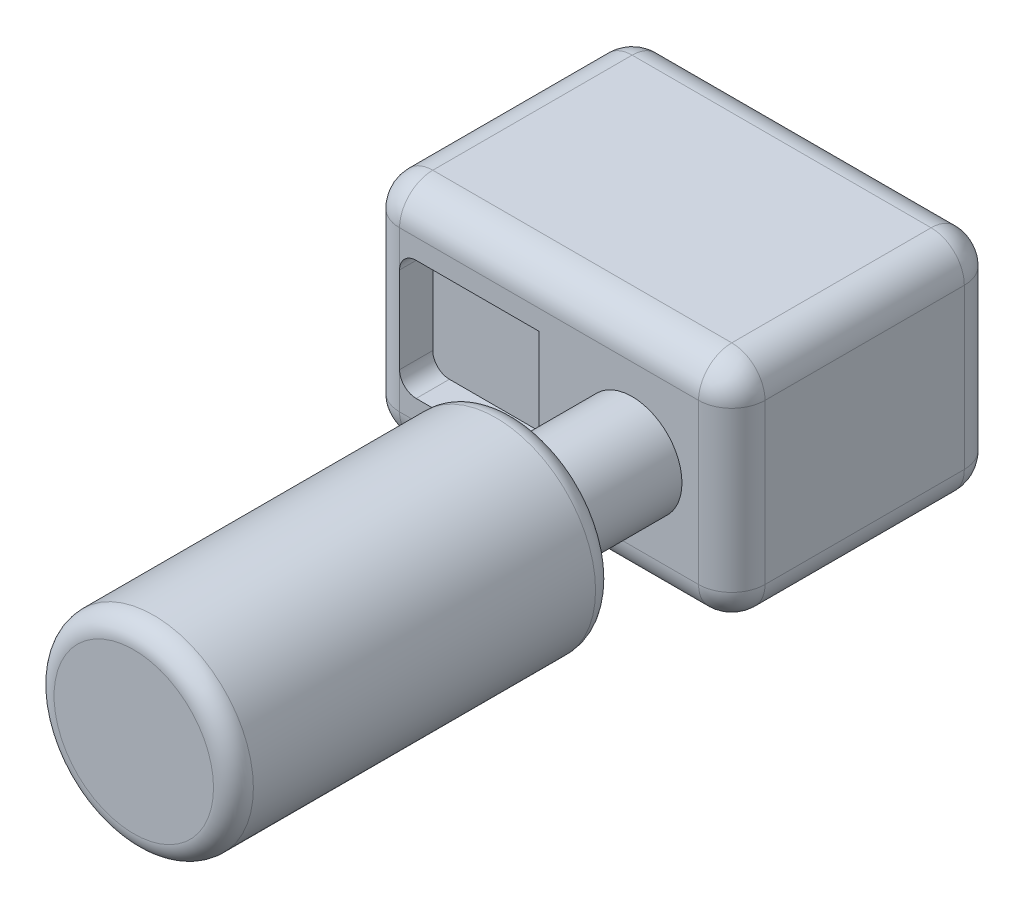
ISO-10303-21;
HEADER;
FILE_DESCRIPTION(('STEP AP214'),'2;1');
FILE_NAME('part.step','',(''),(''),'','','');
FILE_SCHEMA(('AUTOMOTIVE_DESIGN { 1 0 10303 214 1 1 1 1 }'));
ENDSEC;
DATA;
#1=APPLICATION_CONTEXT('core data for automotive mechanical design processes');
#2=APPLICATION_PROTOCOL_DEFINITION('international standard','automotive_design',2000,#1);
#3=PRODUCT_CONTEXT('',#1,'mechanical');
#4=PRODUCT('Part','Part','',(#3));
#5=PRODUCT_RELATED_PRODUCT_CATEGORY('part','',(#4));
#6=PRODUCT_DEFINITION_FORMATION('','',#4);
#7=PRODUCT_DEFINITION_CONTEXT('part definition',#1,'design');
#8=PRODUCT_DEFINITION('design','',#6,#7);
#9=PRODUCT_DEFINITION_SHAPE('','',#8);
#10=(LENGTH_UNIT() NAMED_UNIT(*) SI_UNIT(.MILLI.,.METRE.));
#11=(NAMED_UNIT(*) PLANE_ANGLE_UNIT() SI_UNIT($,.RADIAN.));
#12=(NAMED_UNIT(*) SI_UNIT($,.STERADIAN.) SOLID_ANGLE_UNIT());
#13=UNCERTAINTY_MEASURE_WITH_UNIT(LENGTH_MEASURE(1.E-05),#10,'distance_accuracy_value','');
#14=(GEOMETRIC_REPRESENTATION_CONTEXT(3) GLOBAL_UNCERTAINTY_ASSIGNED_CONTEXT((#13)) GLOBAL_UNIT_ASSIGNED_CONTEXT((#10,
#11,#12)) REPRESENTATION_CONTEXT('',''));
#15=CARTESIAN_POINT('',(0.,0.,0.));
#16=DIRECTION('',(0.,0.,1.));
#17=DIRECTION('',(1.,0.,0.));
#18=AXIS2_PLACEMENT_3D('',#15,#16,#17);
#19=CARTESIAN_POINT('',(46.5074696188145,14.2749169435216,230.));
#20=DIRECTION('',(0.,0.,-1.));
#21=DIRECTION('',(-1.,0.,0.));
#22=AXIS2_PLACEMENT_3D('',#19,#20,#21);
#23=CYLINDRICAL_SURFACE('',#22,30.);
#24=CARTESIAN_POINT('',(46.5074696188145,14.2749169435216,121.));
#25=DIRECTION('',(0.,0.,1.));
#26=DIRECTION('',(1.,0.,0.));
#27=AXIS2_PLACEMENT_3D('',#24,#25,#26);
#28=CIRCLE('',#27,30.);
#29=CARTESIAN_POINT('',(76.5074696188145,14.2749169435216,121.));
#30=VERTEX_POINT('',#29);
#31=EDGE_CURVE('E237',#30,#30,#28,.T.);
#32=ORIENTED_EDGE('',*,*,#31,.T.);
#33=EDGE_LOOP('',(#32));
#34=FACE_BOUND('',#33,.T.);
#35=CARTESIAN_POINT('',(46.5074696188145,14.2749169435216,224.));
#36=DIRECTION('',(0.,0.,1.));
#37=DIRECTION('',(1.,0.,0.));
#38=AXIS2_PLACEMENT_3D('',#35,#36,#37);
#39=CIRCLE('',#38,30.);
#40=CARTESIAN_POINT('',(76.5074696188145,14.2749169435216,224.));
#41=VERTEX_POINT('',#40);
#42=EDGE_CURVE('E234',#41,#41,#39,.F.);
#43=ORIENTED_EDGE('',*,*,#42,.T.);
#44=EDGE_LOOP('',(#43));
#45=FACE_BOUND('',#44,.T.);
#46=ADVANCED_FACE('F41',(#34,#45),#23,.T.);
#47=CARTESIAN_POINT('',(46.5074696188145,14.2749169435216,230.));
#48=DIRECTION('',(0.,0.,1.));
#49=DIRECTION('',(1.,0.,0.));
#50=AXIS2_PLACEMENT_3D('',#47,#48,#49);
#51=PLANE('',#50);
#52=CARTESIAN_POINT('',(46.5074696188145,14.2749169435216,230.));
#53=DIRECTION('',(0.,0.,1.));
#54=DIRECTION('',(1.,0.,0.));
#55=AXIS2_PLACEMENT_3D('',#52,#53,#54);
#56=CIRCLE('',#55,24.);
#57=CARTESIAN_POINT('',(70.5074696188145,14.2749169435216,230.));
#58=VERTEX_POINT('',#57);
#59=EDGE_CURVE('E227',#58,#58,#56,.T.);
#60=ORIENTED_EDGE('',*,*,#59,.T.);
#61=EDGE_LOOP('',(#60));
#62=FACE_BOUND('',#61,.T.);
#63=ADVANCED_FACE('F426',(#62),#51,.T.);
#64=CARTESIAN_POINT('',(46.5074696188145,14.2749169435216,224.));
#65=DIRECTION('',(0.,0.,1.));
#66=DIRECTION('',(1.,0.,0.));
#67=AXIS2_PLACEMENT_3D('',#64,#65,#66);
#68=TOROIDAL_SURFACE('',#67,24.,6.);
#69=ORIENTED_EDGE('',*,*,#42,.F.);
#70=EDGE_LOOP('',(#69));
#71=FACE_BOUND('',#70,.T.);
#72=ORIENTED_EDGE('',*,*,#59,.F.);
#73=EDGE_LOOP('',(#72));
#74=FACE_BOUND('',#73,.T.);
#75=ADVANCED_FACE('F432',(#71,#74),#68,.T.);
#76=CARTESIAN_POINT('',(46.5074696188145,14.2749169435216,115.));
#77=DIRECTION('',(0.,0.,1.));
#78=DIRECTION('',(1.,0.,0.));
#79=AXIS2_PLACEMENT_3D('',#76,#77,#78);
#80=PLANE('',#79);
#81=CARTESIAN_POINT('',(46.5074696188145,14.2749169435216,115.));
#82=DIRECTION('',(0.,0.,1.));
#83=DIRECTION('',(1.,0.,0.));
#84=AXIS2_PLACEMENT_3D('',#81,#82,#83);
#85=CIRCLE('',#84,24.);
#86=CARTESIAN_POINT('',(70.5074696188145,14.2749169435216,115.));
#87=VERTEX_POINT('',#86);
#88=EDGE_CURVE('E240',#87,#87,#85,.F.);
#89=ORIENTED_EDGE('',*,*,#88,.T.);
#90=EDGE_LOOP('',(#89));
#91=FACE_BOUND('',#90,.T.);
#92=CARTESIAN_POINT('',(46.5074696188145,14.2749169435216,115.));
#93=DIRECTION('',(0.,0.,1.));
#94=DIRECTION('',(1.,0.,0.));
#95=AXIS2_PLACEMENT_3D('',#92,#93,#94);
#96=CIRCLE('',#95,15.);
#97=CARTESIAN_POINT('',(61.5074696188145,14.2749169435216,115.));
#98=VERTEX_POINT('',#97);
#99=EDGE_CURVE('E224',#98,#98,#96,.T.);
#100=ORIENTED_EDGE('',*,*,#99,.T.);
#101=EDGE_LOOP('',(#100));
#102=FACE_BOUND('',#101,.T.);
#103=ADVANCED_FACE('F461',(#91,#102),#80,.F.);
#104=CARTESIAN_POINT('',(46.5074696188145,14.2749169435216,115.));
#105=DIRECTION('',(0.,0.,-1.));
#106=DIRECTION('',(-1.,0.,0.));
#107=AXIS2_PLACEMENT_3D('',#104,#105,#106);
#108=CYLINDRICAL_SURFACE('',#107,15.);
#109=ORIENTED_EDGE('',*,*,#99,.F.);
#110=EDGE_LOOP('',(#109));
#111=FACE_BOUND('',#110,.T.);
#112=CARTESIAN_POINT('',(46.5074696188145,14.2749169435216,80.));
#113=DIRECTION('',(0.,0.,1.));
#114=DIRECTION('',(1.,0.,0.));
#115=AXIS2_PLACEMENT_3D('',#112,#113,#114);
#116=CIRCLE('',#115,15.);
#117=CARTESIAN_POINT('',(61.5074696188145,14.2749169435216,80.));
#118=VERTEX_POINT('',#117);
#119=EDGE_CURVE('E228',#118,#118,#116,.T.);
#120=ORIENTED_EDGE('',*,*,#119,.T.);
#121=EDGE_LOOP('',(#120));
#122=FACE_BOUND('',#121,.T.);
#123=ADVANCED_FACE('F447',(#111,#122),#108,.T.);
#124=CARTESIAN_POINT('',(0.,0.,0.));
#125=DIRECTION('',(0.,0.,1.));
#126=DIRECTION('',(1.,0.,0.));
#127=AXIS2_PLACEMENT_3D('',#124,#125,#126);
#128=PLANE('',#127);
#129=DIRECTION('',(-1.,0.,0.));
#130=VECTOR('',#129,1.);
#131=CARTESIAN_POINT('',(0.,38.2749169435216,0.));
#132=LINE('',#131,#130);
#133=CARTESIAN_POINT('',(-23.4925303811855,38.2749169435216,0.));
#134=VERTEX_POINT('',#133);
#135=CARTESIAN_POINT('',(66.5074696188145,38.2749169435216,0.));
#136=VERTEX_POINT('',#135);
#137=EDGE_CURVE('E255',#134,#136,#132,.F.);
#138=ORIENTED_EDGE('',*,*,#137,.T.);
#139=DIRECTION('',(0.,1.,0.));
#140=VECTOR('',#139,1.);
#141=CARTESIAN_POINT('',(66.5074696188145,0.,0.));
#142=LINE('',#141,#140);
#143=CARTESIAN_POINT('',(66.5074696188145,-9.72508305647841,0.));
#144=VERTEX_POINT('',#143);
#145=EDGE_CURVE('E257',#136,#144,#142,.F.);
#146=ORIENTED_EDGE('',*,*,#145,.T.);
#147=DIRECTION('',(1.,0.,0.));
#148=VECTOR('',#147,1.);
#149=CARTESIAN_POINT('',(0.,-9.72508305647841,0.));
#150=LINE('',#149,#148);
#151=CARTESIAN_POINT('',(-23.4925303811855,-9.72508305647841,0.));
#152=VERTEX_POINT('',#151);
#153=EDGE_CURVE('E251',#144,#152,#150,.F.);
#154=ORIENTED_EDGE('',*,*,#153,.T.);
#155=DIRECTION('',(0.,-1.,0.));
#156=VECTOR('',#155,1.);
#157=CARTESIAN_POINT('',(-23.4925303811855,0.,0.));
#158=LINE('',#157,#156);
#159=EDGE_CURVE('E253',#152,#134,#158,.F.);
#160=ORIENTED_EDGE('',*,*,#159,.T.);
#161=EDGE_LOOP('',(#138,#146,#154,#160));
#162=FACE_BOUND('',#161,.T.);
#163=ADVANCED_FACE('F443',(#162),#128,.F.);
#164=CARTESIAN_POINT('',(-33.4925303811855,-19.7250830564784,80.));
#165=DIRECTION('',(0.,1.,0.));
#166=DIRECTION('',(0.,0.,1.));
#167=AXIS2_PLACEMENT_3D('',#164,#165,#166);
#168=PLANE('',#167);
#169=DIRECTION('',(1.,0.,0.));
#170=VECTOR('',#169,1.);
#171=CARTESIAN_POINT('',(-33.4925303811855,-19.7250830564784,70.));
#172=LINE('',#171,#170);
#173=CARTESIAN_POINT('',(66.5074696188145,-19.7250830564784,70.));
#174=VERTEX_POINT('',#173);
#175=CARTESIAN_POINT('',(-23.4925303811855,-19.7250830564784,70.));
#176=VERTEX_POINT('',#175);
#177=EDGE_CURVE('E287',#174,#176,#172,.F.);
#178=ORIENTED_EDGE('',*,*,#177,.T.);
#179=DIRECTION('',(0.,0.,-1.));
#180=VECTOR('',#179,1.);
#181=CARTESIAN_POINT('',(-23.4925303811855,-19.7250830564784,80.));
#182=LINE('',#181,#180);
#183=CARTESIAN_POINT('',(-23.4925303811855,-19.7250830564784,9.99999999999999));
#184=VERTEX_POINT('',#183);
#185=EDGE_CURVE('E294',#176,#184,#182,.T.);
#186=ORIENTED_EDGE('',*,*,#185,.T.);
#187=DIRECTION('',(1.,0.,0.));
#188=VECTOR('',#187,1.);
#189=CARTESIAN_POINT('',(-33.4925303811855,-19.7250830564784,9.99999999999999));
#190=LINE('',#189,#188);
#191=CARTESIAN_POINT('',(66.5074696188145,-19.7250830564784,9.99999999999999));
#192=VERTEX_POINT('',#191);
#193=EDGE_CURVE('E292',#184,#192,#190,.T.);
#194=ORIENTED_EDGE('',*,*,#193,.T.);
#195=DIRECTION('',(0.,0.,-1.));
#196=VECTOR('',#195,1.);
#197=CARTESIAN_POINT('',(66.5074696188145,-19.7250830564784,80.));
#198=LINE('',#197,#196);
#199=EDGE_CURVE('E289',#192,#174,#198,.F.);
#200=ORIENTED_EDGE('',*,*,#199,.T.);
#201=EDGE_LOOP('',(#178,#186,#194,#200));
#202=FACE_BOUND('',#201,.T.);
#203=ADVANCED_FACE('F446',(#202),#168,.F.);
#204=CARTESIAN_POINT('',(-33.4925303811855,48.2749169435216,80.));
#205=DIRECTION('',(1.,0.,0.));
#206=DIRECTION('',(0.,0.,-1.));
#207=AXIS2_PLACEMENT_3D('',#204,#205,#206);
#208=PLANE('',#207);
#209=DIRECTION('',(0.,-1.,0.));
#210=VECTOR('',#209,1.);
#211=CARTESIAN_POINT('',(-33.4925303811855,48.2749169435216,70.));
#212=LINE('',#211,#210);
#213=CARTESIAN_POINT('',(-33.4925303811855,-9.72508305647841,70.));
#214=VERTEX_POINT('',#213);
#215=CARTESIAN_POINT('',(-33.4925303811855,38.2749169435216,70.));
#216=VERTEX_POINT('',#215);
#217=EDGE_CURVE('E280',#214,#216,#212,.F.);
#218=ORIENTED_EDGE('',*,*,#217,.T.);
#219=DIRECTION('',(0.,0.,-1.));
#220=VECTOR('',#219,1.);
#221=CARTESIAN_POINT('',(-33.4925303811855,38.2749169435216,80.));
#222=LINE('',#221,#220);
#223=CARTESIAN_POINT('',(-33.4925303811855,38.2749169435216,9.99999999999999));
#224=VERTEX_POINT('',#223);
#225=EDGE_CURVE('E285',#216,#224,#222,.T.);
#226=ORIENTED_EDGE('',*,*,#225,.T.);
#227=DIRECTION('',(0.,-1.,0.));
#228=VECTOR('',#227,1.);
#229=CARTESIAN_POINT('',(-33.4925303811855,48.2749169435216,9.99999999999999));
#230=LINE('',#229,#228);
#231=CARTESIAN_POINT('',(-33.4925303811855,-9.72508305647841,9.99999999999999));
#232=VERTEX_POINT('',#231);
#233=EDGE_CURVE('E282',#224,#232,#230,.T.);
#234=ORIENTED_EDGE('',*,*,#233,.T.);
#235=DIRECTION('',(0.,0.,-1.));
#236=VECTOR('',#235,1.);
#237=CARTESIAN_POINT('',(-33.4925303811855,-9.72508305647841,80.));
#238=LINE('',#237,#236);
#239=EDGE_CURVE('E278',#232,#214,#238,.F.);
#240=ORIENTED_EDGE('',*,*,#239,.T.);
#241=EDGE_LOOP('',(#218,#226,#234,#240));
#242=FACE_BOUND('',#241,.T.);
#243=ADVANCED_FACE('F403',(#242),#208,.F.);
#244=CARTESIAN_POINT('',(-33.4925303811855,48.2749169435216,80.));
#245=DIRECTION('',(0.,-1.,0.));
#246=DIRECTION('',(0.,0.,-1.));
#247=AXIS2_PLACEMENT_3D('',#244,#245,#246);
#248=PLANE('',#247);
#249=DIRECTION('',(-1.,0.,0.));
#250=VECTOR('',#249,1.);
#251=CARTESIAN_POINT('',(76.5074696188145,48.2749169435216,70.));
#252=LINE('',#251,#250);
#253=CARTESIAN_POINT('',(-23.4925303811855,48.2749169435216,70.));
#254=VERTEX_POINT('',#253);
#255=CARTESIAN_POINT('',(66.5074696188145,48.2749169435216,70.));
#256=VERTEX_POINT('',#255);
#257=EDGE_CURVE('E262',#254,#256,#252,.F.);
#258=ORIENTED_EDGE('',*,*,#257,.T.);
#259=DIRECTION('',(0.,0.,-1.));
#260=VECTOR('',#259,1.);
#261=CARTESIAN_POINT('',(66.5074696188145,48.2749169435216,80.));
#262=LINE('',#261,#260);
#263=CARTESIAN_POINT('',(66.5074696188145,48.2749169435216,9.99999999999999));
#264=VERTEX_POINT('',#263);
#265=EDGE_CURVE('E267',#256,#264,#262,.T.);
#266=ORIENTED_EDGE('',*,*,#265,.T.);
#267=DIRECTION('',(-1.,0.,0.));
#268=VECTOR('',#267,1.);
#269=CARTESIAN_POINT('',(-33.4925303811855,48.2749169435216,9.99999999999999));
#270=LINE('',#269,#268);
#271=CARTESIAN_POINT('',(-23.4925303811855,48.2749169435216,9.99999999999999));
#272=VERTEX_POINT('',#271);
#273=EDGE_CURVE('E265',#264,#272,#270,.T.);
#274=ORIENTED_EDGE('',*,*,#273,.T.);
#275=DIRECTION('',(0.,0.,-1.));
#276=VECTOR('',#275,1.);
#277=CARTESIAN_POINT('',(-23.4925303811855,48.2749169435216,80.));
#278=LINE('',#277,#276);
#279=EDGE_CURVE('E260',#272,#254,#278,.F.);
#280=ORIENTED_EDGE('',*,*,#279,.T.);
#281=EDGE_LOOP('',(#258,#266,#274,#280));
#282=FACE_BOUND('',#281,.T.);
#283=ADVANCED_FACE('F372',(#282),#248,.F.);
#284=CARTESIAN_POINT('',(76.5074696188145,48.2749169435216,80.));
#285=DIRECTION('',(-1.,0.,0.));
#286=DIRECTION('',(0.,0.,1.));
#287=AXIS2_PLACEMENT_3D('',#284,#285,#286);
#288=PLANE('',#287);
#289=DIRECTION('',(0.,0.,-1.));
#290=VECTOR('',#289,1.);
#291=CARTESIAN_POINT('',(76.5074696188145,38.2749169435216,80.));
#292=LINE('',#291,#290);
#293=CARTESIAN_POINT('',(76.5074696188145,38.2749169435216,9.99999999999999));
#294=VERTEX_POINT('',#293);
#295=CARTESIAN_POINT('',(76.5074696188145,38.2749169435216,70.));
#296=VERTEX_POINT('',#295);
#297=EDGE_CURVE('E248',#294,#296,#292,.F.);
#298=ORIENTED_EDGE('',*,*,#297,.T.);
#299=DIRECTION('',(0.,1.,0.));
#300=VECTOR('',#299,1.);
#301=CARTESIAN_POINT('',(76.5074696188145,-9.72508305647841,70.));
#302=LINE('',#301,#300);
#303=CARTESIAN_POINT('',(76.5074696188145,-9.72508305647841,70.));
#304=VERTEX_POINT('',#303);
#305=EDGE_CURVE('E11',#296,#304,#302,.F.);
#306=ORIENTED_EDGE('',*,*,#305,.T.);
#307=DIRECTION('',(0.,0.,-1.));
#308=VECTOR('',#307,1.);
#309=CARTESIAN_POINT('',(76.5074696188145,-9.72508305647841,80.));
#310=LINE('',#309,#308);
#311=CARTESIAN_POINT('',(76.5074696188145,-9.72508305647841,9.99999999999999));
#312=VERTEX_POINT('',#311);
#313=EDGE_CURVE('E243',#304,#312,#310,.T.);
#314=ORIENTED_EDGE('',*,*,#313,.T.);
#315=DIRECTION('',(0.,1.,0.));
#316=VECTOR('',#315,1.);
#317=CARTESIAN_POINT('',(76.5074696188145,48.2749169435216,9.99999999999999));
#318=LINE('',#317,#316);
#319=EDGE_CURVE('E245',#312,#294,#318,.T.);
#320=ORIENTED_EDGE('',*,*,#319,.T.);
#321=EDGE_LOOP('',(#298,#306,#314,#320));
#322=FACE_BOUND('',#321,.T.);
#323=ADVANCED_FACE('F442',(#322),#288,.F.);
#324=CARTESIAN_POINT('',(0.,0.,80.));
#325=DIRECTION('',(0.,0.,1.));
#326=DIRECTION('',(1.,0.,0.));
#327=AXIS2_PLACEMENT_3D('',#324,#325,#326);
#328=PLANE('',#327);
#329=CARTESIAN_POINT('',(-18.4925303811855,1.2749169435216,80.));
#330=DIRECTION('',(0.,0.,1.));
#331=DIRECTION('',(1.,0.,0.));
#332=AXIS2_PLACEMENT_3D('',#329,#330,#331);
#333=CIRCLE('',#332,5.);
#334=CARTESIAN_POINT('',(-23.4925303811855,1.27491694352163,80.));
#335=VERTEX_POINT('',#334);
#336=CARTESIAN_POINT('',(-18.4925303811855,-3.7250830564784,80.));
#337=VERTEX_POINT('',#336);
#338=EDGE_CURVE('E195',#335,#337,#333,.T.);
#339=ORIENTED_EDGE('',*,*,#338,.F.);
#340=DIRECTION('',(0.,-1.,0.));
#341=VECTOR('',#340,1.);
#342=CARTESIAN_POINT('',(-23.4925303811855,-19.7250830564784,80.));
#343=LINE('',#342,#341);
#344=CARTESIAN_POINT('',(-23.4925303811855,-9.72508305647841,80.));
#345=VERTEX_POINT('',#344);
#346=EDGE_CURVE('E272',#335,#345,#343,.T.);
#347=ORIENTED_EDGE('',*,*,#346,.T.);
#348=DIRECTION('',(1.,0.,0.));
#349=VECTOR('',#348,1.);
#350=CARTESIAN_POINT('',(76.5074696188145,-9.72508305647841,80.));
#351=LINE('',#350,#349);
#352=CARTESIAN_POINT('',(66.5074696188145,-9.72508305647841,80.));
#353=VERTEX_POINT('',#352);
#354=EDGE_CURVE('E270',#345,#353,#351,.T.);
#355=ORIENTED_EDGE('',*,*,#354,.T.);
#356=DIRECTION('',(0.,1.,0.));
#357=VECTOR('',#356,1.);
#358=CARTESIAN_POINT('',(66.5074696188145,38.2749169435216,80.));
#359=LINE('',#358,#357);
#360=CARTESIAN_POINT('',(66.5074696188145,38.2749169435216,80.));
#361=VERTEX_POINT('',#360);
#362=EDGE_CURVE('E50',#353,#361,#359,.T.);
#363=ORIENTED_EDGE('',*,*,#362,.T.);
#364=DIRECTION('',(-1.,0.,0.));
#365=VECTOR('',#364,1.);
#366=CARTESIAN_POINT('',(-33.4925303811855,38.2749169435216,80.));
#367=LINE('',#366,#365);
#368=CARTESIAN_POINT('',(-23.4925303811855,38.2749169435216,80.));
#369=VERTEX_POINT('',#368);
#370=EDGE_CURVE('E276',#361,#369,#367,.T.);
#371=ORIENTED_EDGE('',*,*,#370,.T.);
#372=CARTESIAN_POINT('',(-23.4925303811855,27.2749169435216,80.));
#373=VERTEX_POINT('',#372);
#374=EDGE_CURVE('E273',#369,#373,#343,.T.);
#375=ORIENTED_EDGE('',*,*,#374,.T.);
#376=CARTESIAN_POINT('',(-18.4925303811855,27.2749169435216,80.));
#377=DIRECTION('',(0.,0.,1.));
#378=DIRECTION('',(1.,0.,0.));
#379=AXIS2_PLACEMENT_3D('',#376,#377,#378);
#380=CIRCLE('',#379,5.);
#381=CARTESIAN_POINT('',(-18.4925303811855,32.2749169435216,80.));
#382=VERTEX_POINT('',#381);
#383=EDGE_CURVE('E58',#382,#373,#380,.T.);
#384=ORIENTED_EDGE('',*,*,#383,.F.);
#385=DIRECTION('',(-1.,0.,0.));
#386=VECTOR('',#385,1.);
#387=CARTESIAN_POINT('',(-18.4925303811855,32.2749169435216,80.));
#388=LINE('',#387,#386);
#389=CARTESIAN_POINT('',(18.5074696188145,32.2749169435216,80.));
#390=VERTEX_POINT('',#389);
#391=EDGE_CURVE('E206',#390,#382,#388,.T.);
#392=ORIENTED_EDGE('',*,*,#391,.F.);
#393=DIRECTION('',(0.,1.,0.));
#394=VECTOR('',#393,1.);
#395=CARTESIAN_POINT('',(18.5074696188145,32.2749169435216,80.));
#396=LINE('',#395,#394);
#397=CARTESIAN_POINT('',(18.5074696188145,-3.7250830564784,80.));
#398=VERTEX_POINT('',#397);
#399=EDGE_CURVE('E174',#398,#390,#396,.T.);
#400=ORIENTED_EDGE('',*,*,#399,.F.);
#401=DIRECTION('',(1.,0.,0.));
#402=VECTOR('',#401,1.);
#403=CARTESIAN_POINT('',(-18.4925303811855,-3.7250830564784,80.));
#404=LINE('',#403,#402);
#405=EDGE_CURVE('E192',#337,#398,#404,.T.);
#406=ORIENTED_EDGE('',*,*,#405,.F.);
#407=EDGE_LOOP('',(#339,#347,#355,#363,#371,#375,#384,#392,#400,#406));
#408=FACE_BOUND('',#407,.T.);
#409=ORIENTED_EDGE('',*,*,#119,.F.);
#410=EDGE_LOOP('',(#409));
#411=FACE_BOUND('',#410,.T.);
#412=ADVANCED_FACE('F438',(#408,#411),#328,.T.);
#413=CARTESIAN_POINT('',(46.5074696188145,14.2749169435216,121.));
#414=DIRECTION('',(0.,0.,1.));
#415=DIRECTION('',(1.,0.,0.));
#416=AXIS2_PLACEMENT_3D('',#413,#414,#415);
#417=TOROIDAL_SURFACE('',#416,24.,6.);
#418=ORIENTED_EDGE('',*,*,#88,.F.);
#419=EDGE_LOOP('',(#418));
#420=FACE_BOUND('',#419,.T.);
#421=ORIENTED_EDGE('',*,*,#31,.F.);
#422=EDGE_LOOP('',(#421));
#423=FACE_BOUND('',#422,.T.);
#424=ADVANCED_FACE('F441',(#420,#423),#417,.T.);
#425=CARTESIAN_POINT('',(-23.4925303811855,0.,70.));
#426=DIRECTION('',(0.,1.,0.));
#427=DIRECTION('',(0.,0.,1.));
#428=AXIS2_PLACEMENT_3D('',#425,#426,#427);
#429=CYLINDRICAL_SURFACE('',#428,10.);
#430=CARTESIAN_POINT('',(-23.4925303811855,38.2749169435216,70.));
#431=DIRECTION('',(0.,1.,0.));
#432=DIRECTION('',(0.,0.,1.));
#433=AXIS2_PLACEMENT_3D('',#430,#431,#432);
#434=CIRCLE('',#433,10.);
#435=EDGE_CURVE('E339',#216,#369,#434,.T.);
#436=ORIENTED_EDGE('',*,*,#435,.F.);
#437=ORIENTED_EDGE('',*,*,#217,.F.);
#438=CARTESIAN_POINT('',(-23.4925303811855,-9.72508305647841,70.));
#439=DIRECTION('',(0.,-1.,0.));
#440=DIRECTION('',(0.,0.,-1.));
#441=AXIS2_PLACEMENT_3D('',#438,#439,#440);
#442=CIRCLE('',#441,10.);
#443=EDGE_CURVE('E342',#345,#214,#442,.T.);
#444=ORIENTED_EDGE('',*,*,#443,.F.);
#445=ORIENTED_EDGE('',*,*,#346,.F.);
#446=DIRECTION('',(0.,-1.,0.));
#447=VECTOR('',#446,1.);
#448=CARTESIAN_POINT('',(-23.4925303811855,27.2749169435216,80.));
#449=LINE('',#448,#447);
#450=EDGE_CURVE('E209',#373,#335,#449,.T.);
#451=ORIENTED_EDGE('',*,*,#450,.F.);
#452=ORIENTED_EDGE('',*,*,#374,.F.);
#453=EDGE_LOOP('',(#436,#437,#444,#445,#451,#452));
#454=FACE_BOUND('',#453,.T.);
#455=ADVANCED_FACE('F410',(#454),#429,.T.);
#456=CARTESIAN_POINT('',(-23.4925303811855,-9.72508305647841,80.));
#457=DIRECTION('',(0.,0.,-1.));
#458=DIRECTION('',(-1.,0.,0.));
#459=AXIS2_PLACEMENT_3D('',#456,#457,#458);
#460=CYLINDRICAL_SURFACE('',#459,10.);
#461=CARTESIAN_POINT('',(-23.4925303811855,-9.72508305647841,70.));
#462=DIRECTION('',(0.,0.,1.));
#463=DIRECTION('',(1.,0.,0.));
#464=AXIS2_PLACEMENT_3D('',#461,#462,#463);
#465=CIRCLE('',#464,10.);
#466=EDGE_CURVE('E231',#214,#176,#465,.T.);
#467=ORIENTED_EDGE('',*,*,#466,.F.);
#468=ORIENTED_EDGE('',*,*,#239,.F.);
#469=CARTESIAN_POINT('',(-23.4925303811855,-9.72508305647841,9.99999999999999));
#470=DIRECTION('',(0.,0.,-1.));
#471=DIRECTION('',(-1.,0.,0.));
#472=AXIS2_PLACEMENT_3D('',#469,#470,#471);
#473=CIRCLE('',#472,10.);
#474=EDGE_CURVE('E331',#184,#232,#473,.T.);
#475=ORIENTED_EDGE('',*,*,#474,.F.);
#476=ORIENTED_EDGE('',*,*,#185,.F.);
#477=EDGE_LOOP('',(#467,#468,#475,#476));
#478=FACE_BOUND('',#477,.T.);
#479=ADVANCED_FACE('F422',(#478),#460,.T.);
#480=CARTESIAN_POINT('',(-23.4925303811855,-9.72508305647841,70.));
#481=DIRECTION('',(0.,0.,1.));
#482=DIRECTION('',(1.,0.,0.));
#483=AXIS2_PLACEMENT_3D('',#480,#481,#482);
#484=SPHERICAL_SURFACE('',#483,10.);
#485=ORIENTED_EDGE('',*,*,#443,.T.);
#486=ORIENTED_EDGE('',*,*,#466,.T.);
#487=CARTESIAN_POINT('',(-23.4925303811855,-9.72508305647841,70.));
#488=DIRECTION('',(-1.,0.,0.));
#489=DIRECTION('',(0.,0.,1.));
#490=AXIS2_PLACEMENT_3D('',#487,#488,#489);
#491=CIRCLE('',#490,10.);
#492=EDGE_CURVE('E328',#345,#176,#491,.F.);
#493=ORIENTED_EDGE('',*,*,#492,.F.);
#494=EDGE_LOOP('',(#485,#486,#493));
#495=FACE_BOUND('',#494,.T.);
#496=ADVANCED_FACE('F415',(#495),#484,.T.);
#497=CARTESIAN_POINT('',(-23.4925303811855,38.2749169435216,70.));
#498=DIRECTION('',(0.,0.,1.));
#499=DIRECTION('',(1.,0.,0.));
#500=AXIS2_PLACEMENT_3D('',#497,#498,#499);
#501=SPHERICAL_SURFACE('',#500,10.);
#502=CARTESIAN_POINT('',(-23.4925303811855,38.2749169435216,70.));
#503=DIRECTION('',(-1.,0.,0.));
#504=DIRECTION('',(0.,0.,1.));
#505=AXIS2_PLACEMENT_3D('',#502,#503,#504);
#506=CIRCLE('',#505,10.);
#507=EDGE_CURVE('E325',#254,#369,#506,.F.);
#508=ORIENTED_EDGE('',*,*,#507,.F.);
#509=CARTESIAN_POINT('',(-23.4925303811855,38.2749169435216,70.));
#510=DIRECTION('',(0.,0.,1.));
#511=DIRECTION('',(1.,0.,0.));
#512=AXIS2_PLACEMENT_3D('',#509,#510,#511);
#513=CIRCLE('',#512,10.);
#514=EDGE_CURVE('E336',#216,#254,#513,.F.);
#515=ORIENTED_EDGE('',*,*,#514,.F.);
#516=ORIENTED_EDGE('',*,*,#435,.T.);
#517=EDGE_LOOP('',(#508,#515,#516));
#518=FACE_BOUND('',#517,.T.);
#519=ADVANCED_FACE('F413',(#518),#501,.T.);
#520=CARTESIAN_POINT('',(-23.4925303811855,38.2749169435216,80.));
#521=DIRECTION('',(0.,0.,-1.));
#522=DIRECTION('',(-1.,0.,0.));
#523=AXIS2_PLACEMENT_3D('',#520,#521,#522);
#524=CYLINDRICAL_SURFACE('',#523,10.);
#525=ORIENTED_EDGE('',*,*,#514,.T.);
#526=ORIENTED_EDGE('',*,*,#279,.F.);
#527=CARTESIAN_POINT('',(-23.4925303811855,38.2749169435216,9.99999999999999));
#528=DIRECTION('',(0.,0.,-1.));
#529=DIRECTION('',(-1.,0.,0.));
#530=AXIS2_PLACEMENT_3D('',#527,#528,#529);
#531=CIRCLE('',#530,10.);
#532=EDGE_CURVE('E322',#224,#272,#531,.T.);
#533=ORIENTED_EDGE('',*,*,#532,.F.);
#534=ORIENTED_EDGE('',*,*,#225,.F.);
#535=EDGE_LOOP('',(#525,#526,#533,#534));
#536=FACE_BOUND('',#535,.T.);
#537=ADVANCED_FACE('F389',(#536),#524,.T.);
#538=CARTESIAN_POINT('',(-23.4925303811855,48.2749169435216,9.99999999999999));
#539=DIRECTION('',(0.,-1.,0.));
#540=DIRECTION('',(0.,0.,-1.));
#541=AXIS2_PLACEMENT_3D('',#538,#539,#540);
#542=CYLINDRICAL_SURFACE('',#541,10.);
#543=CARTESIAN_POINT('',(-23.4925303811855,-9.72508305647841,9.99999999999999));
#544=DIRECTION('',(0.,-1.,0.));
#545=DIRECTION('',(0.,0.,-1.));
#546=AXIS2_PLACEMENT_3D('',#543,#544,#545);
#547=CIRCLE('',#546,10.);
#548=EDGE_CURVE('E333',#232,#152,#547,.T.);
#549=ORIENTED_EDGE('',*,*,#548,.F.);
#550=ORIENTED_EDGE('',*,*,#233,.F.);
#551=CARTESIAN_POINT('',(-23.4925303811855,38.2749169435216,10.));
#552=DIRECTION('',(0.,1.,0.));
#553=DIRECTION('',(0.,0.,1.));
#554=AXIS2_PLACEMENT_3D('',#551,#552,#553);
#555=CIRCLE('',#554,10.);
#556=EDGE_CURVE('E319',#134,#224,#555,.T.);
#557=ORIENTED_EDGE('',*,*,#556,.F.);
#558=ORIENTED_EDGE('',*,*,#159,.F.);
#559=EDGE_LOOP('',(#549,#550,#557,#558));
#560=FACE_BOUND('',#559,.T.);
#561=ADVANCED_FACE('F400',(#560),#542,.T.);
#562=CARTESIAN_POINT('',(-23.4925303811855,-9.72508305647841,10.));
#563=DIRECTION('',(0.,0.,1.));
#564=DIRECTION('',(1.,0.,0.));
#565=AXIS2_PLACEMENT_3D('',#562,#563,#564);
#566=SPHERICAL_SURFACE('',#565,10.);
#567=ORIENTED_EDGE('',*,*,#474,.T.);
#568=ORIENTED_EDGE('',*,*,#548,.T.);
#569=CARTESIAN_POINT('',(-23.4925303811855,-9.72508305647841,10.));
#570=DIRECTION('',(-1.,0.,0.));
#571=DIRECTION('',(0.,0.,1.));
#572=AXIS2_PLACEMENT_3D('',#569,#570,#571);
#573=CIRCLE('',#572,10.);
#574=EDGE_CURVE('E316',#184,#152,#573,.F.);
#575=ORIENTED_EDGE('',*,*,#574,.F.);
#576=EDGE_LOOP('',(#567,#568,#575));
#577=FACE_BOUND('',#576,.T.);
#578=ADVANCED_FACE('F496',(#577),#566,.T.);
#579=CARTESIAN_POINT('',(0.,-9.72508305647841,70.));
#580=DIRECTION('',(-1.,0.,0.));
#581=DIRECTION('',(0.,0.,1.));
#582=AXIS2_PLACEMENT_3D('',#579,#580,#581);
#583=CYLINDRICAL_SURFACE('',#582,10.);
#584=ORIENTED_EDGE('',*,*,#177,.F.);
#585=CARTESIAN_POINT('',(66.5074696188145,-9.72508305647841,70.));
#586=DIRECTION('',(-1.,0.,0.));
#587=DIRECTION('',(0.,0.,1.));
#588=AXIS2_PLACEMENT_3D('',#585,#586,#587);
#589=CIRCLE('',#588,10.);
#590=EDGE_CURVE('E349',#174,#353,#589,.T.);
#591=ORIENTED_EDGE('',*,*,#590,.T.);
#592=ORIENTED_EDGE('',*,*,#354,.F.);
#593=ORIENTED_EDGE('',*,*,#492,.T.);
#594=EDGE_LOOP('',(#584,#591,#592,#593));
#595=FACE_BOUND('',#594,.T.);
#596=ADVANCED_FACE('F493',(#595),#583,.T.);
#597=CARTESIAN_POINT('',(0.,38.2749169435216,70.));
#598=DIRECTION('',(1.,0.,0.));
#599=DIRECTION('',(0.,0.,-1.));
#600=AXIS2_PLACEMENT_3D('',#597,#598,#599);
#601=CYLINDRICAL_SURFACE('',#600,10.);
#602=ORIENTED_EDGE('',*,*,#370,.F.);
#603=CARTESIAN_POINT('',(66.5074696188145,38.2749169435216,70.));
#604=DIRECTION('',(1.,0.,0.));
#605=DIRECTION('',(0.,0.,-1.));
#606=AXIS2_PLACEMENT_3D('',#603,#604,#605);
#607=CIRCLE('',#606,10.);
#608=EDGE_CURVE('E353',#361,#256,#607,.F.);
#609=ORIENTED_EDGE('',*,*,#608,.T.);
#610=ORIENTED_EDGE('',*,*,#257,.F.);
#611=ORIENTED_EDGE('',*,*,#507,.T.);
#612=EDGE_LOOP('',(#602,#609,#610,#611));
#613=FACE_BOUND('',#612,.T.);
#614=ADVANCED_FACE('F369',(#613),#601,.T.);
#615=CARTESIAN_POINT('',(-23.4925303811855,38.2749169435216,10.));
#616=DIRECTION('',(0.,0.,1.));
#617=DIRECTION('',(1.,0.,0.));
#618=AXIS2_PLACEMENT_3D('',#615,#616,#617);
#619=SPHERICAL_SURFACE('',#618,10.);
#620=ORIENTED_EDGE('',*,*,#556,.T.);
#621=ORIENTED_EDGE('',*,*,#532,.T.);
#622=CARTESIAN_POINT('',(-23.4925303811855,38.2749169435216,9.99999999999999));
#623=DIRECTION('',(-1.,0.,0.));
#624=DIRECTION('',(0.,0.,1.));
#625=AXIS2_PLACEMENT_3D('',#622,#623,#624);
#626=CIRCLE('',#625,10.);
#627=EDGE_CURVE('E313',#134,#272,#626,.F.);
#628=ORIENTED_EDGE('',*,*,#627,.F.);
#629=EDGE_LOOP('',(#620,#621,#628));
#630=FACE_BOUND('',#629,.T.);
#631=ADVANCED_FACE('F394',(#630),#619,.T.);
#632=CARTESIAN_POINT('',(-33.4925303811855,-9.72508305647841,9.99999999999999));
#633=DIRECTION('',(1.,0.,0.));
#634=DIRECTION('',(0.,0.,-1.));
#635=AXIS2_PLACEMENT_3D('',#632,#633,#634);
#636=CYLINDRICAL_SURFACE('',#635,10.);
#637=ORIENTED_EDGE('',*,*,#574,.T.);
#638=ORIENTED_EDGE('',*,*,#153,.F.);
#639=CARTESIAN_POINT('',(66.5074696188145,-9.72508305647841,9.99999999999999));
#640=DIRECTION('',(1.,0.,0.));
#641=DIRECTION('',(0.,0.,-1.));
#642=AXIS2_PLACEMENT_3D('',#639,#640,#641);
#643=CIRCLE('',#642,10.);
#644=EDGE_CURVE('E310',#192,#144,#643,.T.);
#645=ORIENTED_EDGE('',*,*,#644,.F.);
#646=ORIENTED_EDGE('',*,*,#193,.F.);
#647=EDGE_LOOP('',(#637,#638,#645,#646));
#648=FACE_BOUND('',#647,.T.);
#649=ADVANCED_FACE('F484',(#648),#636,.T.);
#650=CARTESIAN_POINT('',(66.5074696188145,-9.72508305647841,80.));
#651=DIRECTION('',(0.,0.,-1.));
#652=DIRECTION('',(-1.,0.,0.));
#653=AXIS2_PLACEMENT_3D('',#650,#651,#652);
#654=CYLINDRICAL_SURFACE('',#653,10.);
#655=ORIENTED_EDGE('',*,*,#313,.F.);
#656=CARTESIAN_POINT('',(66.5074696188145,-9.72508305647841,70.));
#657=DIRECTION('',(0.,0.,-1.));
#658=DIRECTION('',(-1.,0.,0.));
#659=AXIS2_PLACEMENT_3D('',#656,#657,#658);
#660=CIRCLE('',#659,10.);
#661=EDGE_CURVE('E297',#304,#174,#660,.T.);
#662=ORIENTED_EDGE('',*,*,#661,.T.);
#663=ORIENTED_EDGE('',*,*,#199,.F.);
#664=CARTESIAN_POINT('',(66.5074696188145,-9.72508305647841,9.99999999999999));
#665=DIRECTION('',(0.,0.,-1.));
#666=DIRECTION('',(-1.,0.,0.));
#667=AXIS2_PLACEMENT_3D('',#664,#665,#666);
#668=CIRCLE('',#667,10.);
#669=EDGE_CURVE('E307',#312,#192,#668,.T.);
#670=ORIENTED_EDGE('',*,*,#669,.F.);
#671=EDGE_LOOP('',(#655,#662,#663,#670));
#672=FACE_BOUND('',#671,.T.);
#673=ADVANCED_FACE('F481',(#672),#654,.T.);
#674=CARTESIAN_POINT('',(66.5074696188145,38.2749169435216,80.));
#675=DIRECTION('',(0.,0.,-1.));
#676=DIRECTION('',(-1.,0.,0.));
#677=AXIS2_PLACEMENT_3D('',#674,#675,#676);
#678=CYLINDRICAL_SURFACE('',#677,10.);
#679=ORIENTED_EDGE('',*,*,#265,.F.);
#680=CARTESIAN_POINT('',(66.5074696188145,38.2749169435216,70.));
#681=DIRECTION('',(0.,0.,-1.));
#682=DIRECTION('',(-1.,0.,0.));
#683=AXIS2_PLACEMENT_3D('',#680,#681,#682);
#684=CIRCLE('',#683,10.);
#685=EDGE_CURVE('E351',#256,#296,#684,.T.);
#686=ORIENTED_EDGE('',*,*,#685,.T.);
#687=ORIENTED_EDGE('',*,*,#297,.F.);
#688=CARTESIAN_POINT('',(66.5074696188145,38.2749169435216,9.99999999999999));
#689=DIRECTION('',(0.,0.,-1.));
#690=DIRECTION('',(-1.,0.,0.));
#691=AXIS2_PLACEMENT_3D('',#688,#689,#690);
#692=CIRCLE('',#691,10.);
#693=EDGE_CURVE('E304',#264,#294,#692,.T.);
#694=ORIENTED_EDGE('',*,*,#693,.F.);
#695=EDGE_LOOP('',(#679,#686,#687,#694));
#696=FACE_BOUND('',#695,.T.);
#697=ADVANCED_FACE('F376',(#696),#678,.T.);
#698=CARTESIAN_POINT('',(-33.4925303811855,38.2749169435216,9.99999999999999));
#699=DIRECTION('',(-1.,0.,0.));
#700=DIRECTION('',(0.,0.,1.));
#701=AXIS2_PLACEMENT_3D('',#698,#699,#700);
#702=CYLINDRICAL_SURFACE('',#701,10.);
#703=ORIENTED_EDGE('',*,*,#627,.T.);
#704=ORIENTED_EDGE('',*,*,#273,.F.);
#705=CARTESIAN_POINT('',(66.5074696188145,38.2749169435216,10.));
#706=DIRECTION('',(1.,0.,0.));
#707=DIRECTION('',(0.,0.,-1.));
#708=AXIS2_PLACEMENT_3D('',#705,#706,#707);
#709=CIRCLE('',#708,10.);
#710=EDGE_CURVE('E302',#136,#264,#709,.T.);
#711=ORIENTED_EDGE('',*,*,#710,.F.);
#712=ORIENTED_EDGE('',*,*,#137,.F.);
#713=EDGE_LOOP('',(#703,#704,#711,#712));
#714=FACE_BOUND('',#713,.T.);
#715=ADVANCED_FACE('F383',(#714),#702,.T.);
#716=CARTESIAN_POINT('',(66.5074696188145,-9.72508305647841,10.));
#717=DIRECTION('',(0.,0.,1.));
#718=DIRECTION('',(1.,0.,0.));
#719=AXIS2_PLACEMENT_3D('',#716,#717,#718);
#720=SPHERICAL_SURFACE('',#719,10.);
#721=ORIENTED_EDGE('',*,*,#669,.T.);
#722=ORIENTED_EDGE('',*,*,#644,.T.);
#723=CARTESIAN_POINT('',(66.5074696188145,-9.72508305647841,10.));
#724=DIRECTION('',(0.,-1.,0.));
#725=DIRECTION('',(1.,0.,0.));
#726=AXIS2_PLACEMENT_3D('',#723,#724,#725);
#727=CIRCLE('',#726,10.);
#728=EDGE_CURVE('E300',#312,#144,#727,.F.);
#729=ORIENTED_EDGE('',*,*,#728,.F.);
#730=EDGE_LOOP('',(#721,#722,#729));
#731=FACE_BOUND('',#730,.T.);
#732=ADVANCED_FACE('F473',(#731),#720,.T.);
#733=CARTESIAN_POINT('',(66.5074696188145,38.2749169435216,10.));
#734=DIRECTION('',(0.,0.,1.));
#735=DIRECTION('',(1.,0.,0.));
#736=AXIS2_PLACEMENT_3D('',#733,#734,#735);
#737=SPHERICAL_SURFACE('',#736,10.);
#738=ORIENTED_EDGE('',*,*,#710,.T.);
#739=ORIENTED_EDGE('',*,*,#693,.T.);
#740=CARTESIAN_POINT('',(66.5074696188145,38.2749169435216,9.99999999999999));
#741=DIRECTION('',(0.,1.,0.));
#742=DIRECTION('',(0.,0.,1.));
#743=AXIS2_PLACEMENT_3D('',#740,#741,#742);
#744=CIRCLE('',#743,10.);
#745=EDGE_CURVE('E298',#136,#294,#744,.F.);
#746=ORIENTED_EDGE('',*,*,#745,.F.);
#747=EDGE_LOOP('',(#738,#739,#746));
#748=FACE_BOUND('',#747,.T.);
#749=ADVANCED_FACE('F469',(#748),#737,.T.);
#750=CARTESIAN_POINT('',(66.5074696188145,48.2749169435216,9.99999999999999));
#751=DIRECTION('',(0.,1.,0.));
#752=DIRECTION('',(0.,0.,1.));
#753=AXIS2_PLACEMENT_3D('',#750,#751,#752);
#754=CYLINDRICAL_SURFACE('',#753,10.);
#755=ORIENTED_EDGE('',*,*,#728,.T.);
#756=ORIENTED_EDGE('',*,*,#145,.F.);
#757=ORIENTED_EDGE('',*,*,#745,.T.);
#758=ORIENTED_EDGE('',*,*,#319,.F.);
#759=EDGE_LOOP('',(#755,#756,#757,#758));
#760=FACE_BOUND('',#759,.T.);
#761=ADVANCED_FACE('F466',(#760),#754,.T.);
#762=CARTESIAN_POINT('',(66.5074696188145,38.2749169435216,70.));
#763=DIRECTION('',(0.,0.,1.));
#764=DIRECTION('',(1.,0.,0.));
#765=AXIS2_PLACEMENT_3D('',#762,#763,#764);
#766=SPHERICAL_SURFACE('',#765,10.);
#767=ORIENTED_EDGE('',*,*,#685,.F.);
#768=ORIENTED_EDGE('',*,*,#608,.F.);
#769=CARTESIAN_POINT('',(66.5074696188145,38.2749169435216,70.));
#770=DIRECTION('',(0.,-1.,0.));
#771=DIRECTION('',(0.,0.,-1.));
#772=AXIS2_PLACEMENT_3D('',#769,#770,#771);
#773=CIRCLE('',#772,10.);
#774=EDGE_CURVE('E45',#296,#361,#773,.T.);
#775=ORIENTED_EDGE('',*,*,#774,.F.);
#776=EDGE_LOOP('',(#767,#768,#775));
#777=FACE_BOUND('',#776,.T.);
#778=ADVANCED_FACE('F43',(#777),#766,.T.);
#779=CARTESIAN_POINT('',(66.5074696188145,0.,70.));
#780=DIRECTION('',(0.,-1.,0.));
#781=DIRECTION('',(0.,0.,-1.));
#782=AXIS2_PLACEMENT_3D('',#779,#780,#781);
#783=CYLINDRICAL_SURFACE('',#782,10.);
#784=ORIENTED_EDGE('',*,*,#774,.T.);
#785=ORIENTED_EDGE('',*,*,#362,.F.);
#786=CARTESIAN_POINT('',(66.5074696188145,-9.72508305647841,70.));
#787=DIRECTION('',(0.,-1.,0.));
#788=DIRECTION('',(0.,0.,-1.));
#789=AXIS2_PLACEMENT_3D('',#786,#787,#788);
#790=CIRCLE('',#789,10.);
#791=EDGE_CURVE('E216',#304,#353,#790,.T.);
#792=ORIENTED_EDGE('',*,*,#791,.F.);
#793=ORIENTED_EDGE('',*,*,#305,.F.);
#794=EDGE_LOOP('',(#784,#785,#792,#793));
#795=FACE_BOUND('',#794,.T.);
#796=ADVANCED_FACE('F363',(#795),#783,.T.);
#797=CARTESIAN_POINT('',(66.5074696188145,-9.72508305647841,70.));
#798=DIRECTION('',(0.,0.,1.));
#799=DIRECTION('',(1.,0.,0.));
#800=AXIS2_PLACEMENT_3D('',#797,#798,#799);
#801=SPHERICAL_SURFACE('',#800,10.);
#802=ORIENTED_EDGE('',*,*,#791,.T.);
#803=ORIENTED_EDGE('',*,*,#590,.F.);
#804=ORIENTED_EDGE('',*,*,#661,.F.);
#805=EDGE_LOOP('',(#802,#803,#804));
#806=FACE_BOUND('',#805,.T.);
#807=ADVANCED_FACE('F567',(#806),#801,.T.);
#808=CARTESIAN_POINT('',(18.5074696188145,32.2749169435216,70.));
#809=DIRECTION('',(1.,0.,0.));
#810=DIRECTION('',(0.,0.,-1.));
#811=AXIS2_PLACEMENT_3D('',#808,#809,#810);
#812=PLANE('',#811);
#813=ORIENTED_EDGE('',*,*,#399,.T.);
#814=DIRECTION('',(0.,0.,1.));
#815=VECTOR('',#814,1.);
#816=CARTESIAN_POINT('',(18.5074696188145,32.2749169435216,70.));
#817=LINE('',#816,#815);
#818=CARTESIAN_POINT('',(18.5074696188145,32.2749169435216,70.));
#819=VERTEX_POINT('',#818);
#820=EDGE_CURVE('E167',#819,#390,#817,.T.);
#821=ORIENTED_EDGE('',*,*,#820,.F.);
#822=DIRECTION('',(0.,1.,0.));
#823=VECTOR('',#822,1.);
#824=CARTESIAN_POINT('',(18.5074696188145,32.2749169435216,70.));
#825=LINE('',#824,#823);
#826=CARTESIAN_POINT('',(18.5074696188145,-3.7250830564784,70.));
#827=VERTEX_POINT('',#826);
#828=EDGE_CURVE('E171',#827,#819,#825,.T.);
#829=ORIENTED_EDGE('',*,*,#828,.F.);
#830=DIRECTION('',(0.,0.,1.));
#831=VECTOR('',#830,1.);
#832=CARTESIAN_POINT('',(18.5074696188145,-3.7250830564784,70.));
#833=LINE('',#832,#831);
#834=EDGE_CURVE('E214',#827,#398,#833,.T.);
#835=ORIENTED_EDGE('',*,*,#834,.T.);
#836=EDGE_LOOP('',(#813,#821,#829,#835));
#837=FACE_BOUND('',#836,.T.);
#838=ADVANCED_FACE('F169',(#837),#812,.F.);
#839=CARTESIAN_POINT('',(-18.4925303811855,-3.7250830564784,70.));
#840=DIRECTION('',(0.,-1.,0.));
#841=DIRECTION('',(0.,0.,-1.));
#842=AXIS2_PLACEMENT_3D('',#839,#840,#841);
#843=PLANE('',#842);
#844=ORIENTED_EDGE('',*,*,#405,.T.);
#845=ORIENTED_EDGE('',*,*,#834,.F.);
#846=DIRECTION('',(1.,0.,0.));
#847=VECTOR('',#846,1.);
#848=CARTESIAN_POINT('',(-18.4925303811855,-3.7250830564784,70.));
#849=LINE('',#848,#847);
#850=CARTESIAN_POINT('',(-18.4925303811855,-3.7250830564784,70.));
#851=VERTEX_POINT('',#850);
#852=EDGE_CURVE('E179',#851,#827,#849,.T.);
#853=ORIENTED_EDGE('',*,*,#852,.F.);
#854=DIRECTION('',(0.,0.,1.));
#855=VECTOR('',#854,1.);
#856=CARTESIAN_POINT('',(-18.4925303811855,-3.7250830564784,70.));
#857=LINE('',#856,#855);
#858=EDGE_CURVE('E217',#851,#337,#857,.T.);
#859=ORIENTED_EDGE('',*,*,#858,.T.);
#860=EDGE_LOOP('',(#844,#845,#853,#859));
#861=FACE_BOUND('',#860,.T.);
#862=ADVANCED_FACE('F579',(#861),#843,.F.);
#863=CARTESIAN_POINT('',(-18.4925303811855,1.2749169435216,70.));
#864=DIRECTION('',(0.,0.,1.));
#865=DIRECTION('',(1.,0.,0.));
#866=AXIS2_PLACEMENT_3D('',#863,#864,#865);
#867=CYLINDRICAL_SURFACE('',#866,5.);
#868=ORIENTED_EDGE('',*,*,#338,.T.);
#869=ORIENTED_EDGE('',*,*,#858,.F.);
#870=CARTESIAN_POINT('',(-18.4925303811855,1.2749169435216,70.));
#871=DIRECTION('',(0.,0.,1.));
#872=DIRECTION('',(1.,0.,0.));
#873=AXIS2_PLACEMENT_3D('',#870,#871,#872);
#874=CIRCLE('',#873,5.);
#875=CARTESIAN_POINT('',(-23.4925303811855,1.27491694352163,70.));
#876=VERTEX_POINT('',#875);
#877=EDGE_CURVE('E202',#876,#851,#874,.T.);
#878=ORIENTED_EDGE('',*,*,#877,.F.);
#879=DIRECTION('',(0.,0.,1.));
#880=VECTOR('',#879,1.);
#881=CARTESIAN_POINT('',(-23.4925303811855,1.27491694352163,70.));
#882=LINE('',#881,#880);
#883=EDGE_CURVE('E219',#876,#335,#882,.T.);
#884=ORIENTED_EDGE('',*,*,#883,.T.);
#885=EDGE_LOOP('',(#868,#869,#878,#884));
#886=FACE_BOUND('',#885,.T.);
#887=ADVANCED_FACE('F587',(#886),#867,.F.);
#888=CARTESIAN_POINT('',(-23.4925303811855,27.2749169435216,70.));
#889=DIRECTION('',(-1.,0.,0.));
#890=DIRECTION('',(0.,0.,1.));
#891=AXIS2_PLACEMENT_3D('',#888,#889,#890);
#892=PLANE('',#891);
#893=ORIENTED_EDGE('',*,*,#450,.T.);
#894=ORIENTED_EDGE('',*,*,#883,.F.);
#895=DIRECTION('',(0.,-1.,0.));
#896=VECTOR('',#895,1.);
#897=CARTESIAN_POINT('',(-23.4925303811855,27.2749169435216,70.));
#898=LINE('',#897,#896);
#899=CARTESIAN_POINT('',(-23.4925303811855,27.2749169435216,70.));
#900=VERTEX_POINT('',#899);
#901=EDGE_CURVE('E199',#900,#876,#898,.T.);
#902=ORIENTED_EDGE('',*,*,#901,.F.);
#903=DIRECTION('',(0.,0.,1.));
#904=VECTOR('',#903,1.);
#905=CARTESIAN_POINT('',(-23.4925303811855,27.2749169435216,70.));
#906=LINE('',#905,#904);
#907=EDGE_CURVE('E221',#900,#373,#906,.T.);
#908=ORIENTED_EDGE('',*,*,#907,.T.);
#909=EDGE_LOOP('',(#893,#894,#902,#908));
#910=FACE_BOUND('',#909,.T.);
#911=ADVANCED_FACE('F595',(#910),#892,.F.);
#912=CARTESIAN_POINT('',(-18.4925303811855,27.2749169435216,70.));
#913=DIRECTION('',(0.,0.,1.));
#914=DIRECTION('',(1.,0.,0.));
#915=AXIS2_PLACEMENT_3D('',#912,#913,#914);
#916=CYLINDRICAL_SURFACE('',#915,5.);
#917=ORIENTED_EDGE('',*,*,#383,.T.);
#918=ORIENTED_EDGE('',*,*,#907,.F.);
#919=CARTESIAN_POINT('',(-18.4925303811855,27.2749169435216,70.));
#920=DIRECTION('',(0.,0.,1.));
#921=DIRECTION('',(1.,0.,0.));
#922=AXIS2_PLACEMENT_3D('',#919,#920,#921);
#923=CIRCLE('',#922,5.);
#924=CARTESIAN_POINT('',(-18.4925303811855,32.2749169435216,70.));
#925=VERTEX_POINT('',#924);
#926=EDGE_CURVE('E187',#925,#900,#923,.T.);
#927=ORIENTED_EDGE('',*,*,#926,.F.);
#928=DIRECTION('',(0.,0.,1.));
#929=VECTOR('',#928,1.);
#930=CARTESIAN_POINT('',(-18.4925303811855,32.2749169435216,70.));
#931=LINE('',#930,#929);
#932=EDGE_CURVE('E178',#925,#382,#931,.T.);
#933=ORIENTED_EDGE('',*,*,#932,.T.);
#934=EDGE_LOOP('',(#917,#918,#927,#933));
#935=FACE_BOUND('',#934,.T.);
#936=ADVANCED_FACE('F603',(#935),#916,.F.);
#937=CARTESIAN_POINT('',(-18.4925303811855,32.2749169435216,70.));
#938=DIRECTION('',(0.,1.,0.));
#939=DIRECTION('',(0.,0.,1.));
#940=AXIS2_PLACEMENT_3D('',#937,#938,#939);
#941=PLANE('',#940);
#942=ORIENTED_EDGE('',*,*,#391,.T.);
#943=ORIENTED_EDGE('',*,*,#932,.F.);
#944=DIRECTION('',(-1.,0.,0.));
#945=VECTOR('',#944,1.);
#946=CARTESIAN_POINT('',(-18.4925303811855,32.2749169435216,70.));
#947=LINE('',#946,#945);
#948=EDGE_CURVE('E182',#819,#925,#947,.T.);
#949=ORIENTED_EDGE('',*,*,#948,.F.);
#950=ORIENTED_EDGE('',*,*,#820,.T.);
#951=EDGE_LOOP('',(#942,#943,#949,#950));
#952=FACE_BOUND('',#951,.T.);
#953=ADVANCED_FACE('F183',(#952),#941,.F.);
#954=CARTESIAN_POINT('',(-18.4925303811855,1.2749169435216,70.));
#955=DIRECTION('',(0.,0.,1.));
#956=DIRECTION('',(1.,0.,0.));
#957=AXIS2_PLACEMENT_3D('',#954,#955,#956);
#958=PLANE('',#957);
#959=ORIENTED_EDGE('',*,*,#828,.T.);
#960=ORIENTED_EDGE('',*,*,#948,.T.);
#961=ORIENTED_EDGE('',*,*,#926,.T.);
#962=ORIENTED_EDGE('',*,*,#901,.T.);
#963=ORIENTED_EDGE('',*,*,#877,.T.);
#964=ORIENTED_EDGE('',*,*,#852,.T.);
#965=EDGE_LOOP('',(#959,#960,#961,#962,#963,#964));
#966=FACE_BOUND('',#965,.T.);
#967=ADVANCED_FACE('F189',(#966),#958,.T.);
#968=CLOSED_SHELL('',(#46,#63,#75,#103,#123,#163,#203,#243,#283,#323,#412,#424,#455,#479,#496,
#519,#537,#561,#578,#596,#614,#631,#649,#673,#697,#715,#732,#749,#761,#778,#796,#807,#838,#862,
#887,#911,#936,#953,#967));
#969=MANIFOLD_SOLID_BREP('B2',#968);
#970=ADVANCED_BREP_SHAPE_REPRESENTATION('',(#18,#969),#14);
#971=SHAPE_DEFINITION_REPRESENTATION(#9,#970);
ENDSEC;
END-ISO-10303-21;
